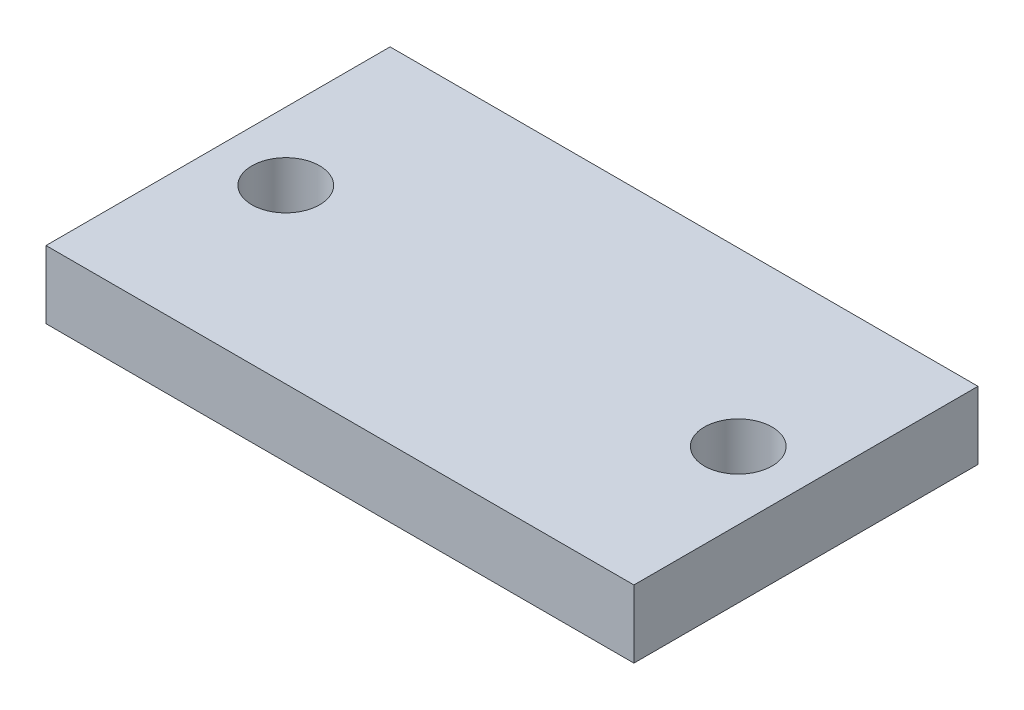
ISO-10303-21;
HEADER;
FILE_DESCRIPTION(('STEP AP214'),'2;1');
FILE_NAME('part.step','',(''),(''),'','','');
FILE_SCHEMA(('AUTOMOTIVE_DESIGN { 1 0 10303 214 1 1 1 1 }'));
ENDSEC;
DATA;
#1=APPLICATION_CONTEXT('core data for automotive mechanical design processes');
#2=APPLICATION_PROTOCOL_DEFINITION('international standard','automotive_design',2000,#1);
#3=PRODUCT_CONTEXT('',#1,'mechanical');
#4=PRODUCT('Part','Part','',(#3));
#5=PRODUCT_RELATED_PRODUCT_CATEGORY('part','',(#4));
#6=PRODUCT_DEFINITION_FORMATION('','',#4);
#7=PRODUCT_DEFINITION_CONTEXT('part definition',#1,'design');
#8=PRODUCT_DEFINITION('design','',#6,#7);
#9=PRODUCT_DEFINITION_SHAPE('','',#8);
#10=(LENGTH_UNIT() NAMED_UNIT(*) SI_UNIT(.MILLI.,.METRE.));
#11=(NAMED_UNIT(*) PLANE_ANGLE_UNIT() SI_UNIT($,.RADIAN.));
#12=(NAMED_UNIT(*) SI_UNIT($,.STERADIAN.) SOLID_ANGLE_UNIT());
#13=UNCERTAINTY_MEASURE_WITH_UNIT(LENGTH_MEASURE(1.E-05),#10,'distance_accuracy_value','');
#14=(GEOMETRIC_REPRESENTATION_CONTEXT(3) GLOBAL_UNCERTAINTY_ASSIGNED_CONTEXT((#13)) GLOBAL_UNIT_ASSIGNED_CONTEXT((#10,
#11,#12)) REPRESENTATION_CONTEXT('',''));
#15=CARTESIAN_POINT('',(0.,0.,0.));
#16=DIRECTION('',(0.,0.,1.));
#17=DIRECTION('',(1.,0.,0.));
#18=AXIS2_PLACEMENT_3D('',#15,#16,#17);
#19=CARTESIAN_POINT('',(0.,5.,0.));
#20=DIRECTION('',(0.,0.,-1.));
#21=DIRECTION('',(-1.,0.,0.));
#22=AXIS2_PLACEMENT_3D('',#19,#20,#21);
#23=PLANE('',#22);
#24=DIRECTION('',(1.,0.,0.));
#25=VECTOR('',#24,1.);
#26=CARTESIAN_POINT('',(0.,0.,0.));
#27=LINE('',#26,#25);
#28=CARTESIAN_POINT('',(-9.00000000000002,0.,0.));
#29=VERTEX_POINT('',#28);
#30=CARTESIAN_POINT('',(34.4,0.,0.));
#31=VERTEX_POINT('',#30);
#32=EDGE_CURVE('E95',#29,#31,#27,.T.);
#33=ORIENTED_EDGE('',*,*,#32,.T.);
#34=DIRECTION('',(0.,1.,0.));
#35=VECTOR('',#34,1.);
#36=CARTESIAN_POINT('',(34.4,-50.2863798657251,0.));
#37=LINE('',#36,#35);
#38=CARTESIAN_POINT('',(34.4,5.,0.));
#39=VERTEX_POINT('',#38);
#40=EDGE_CURVE('E74',#31,#39,#37,.T.);
#41=ORIENTED_EDGE('',*,*,#40,.T.);
#42=DIRECTION('',(1.,0.,0.));
#43=VECTOR('',#42,1.);
#44=CARTESIAN_POINT('',(0.,5.,0.));
#45=LINE('',#44,#43);
#46=CARTESIAN_POINT('',(-9.00000000000002,5.,0.));
#47=VERTEX_POINT('',#46);
#48=EDGE_CURVE('E42',#47,#39,#45,.T.);
#49=ORIENTED_EDGE('',*,*,#48,.F.);
#50=DIRECTION('',(0.,1.,0.));
#51=VECTOR('',#50,1.);
#52=CARTESIAN_POINT('',(-9.00000000000002,-50.2863798657251,0.));
#53=LINE('',#52,#51);
#54=EDGE_CURVE('E72',#29,#47,#53,.T.);
#55=ORIENTED_EDGE('',*,*,#54,.F.);
#56=EDGE_LOOP('',(#33,#41,#49,#55));
#57=FACE_BOUND('',#56,.T.);
#58=ADVANCED_FACE('F33',(#57),#23,.F.);
#59=CARTESIAN_POINT('',(0.,5.,-25.4));
#60=DIRECTION('',(0.,0.,-1.));
#61=DIRECTION('',(-1.,0.,0.));
#62=AXIS2_PLACEMENT_3D('',#59,#60,#61);
#63=PLANE('',#62);
#64=DIRECTION('',(1.,0.,0.));
#65=VECTOR('',#64,1.);
#66=CARTESIAN_POINT('',(0.,5.,-25.4));
#67=LINE('',#66,#65);
#68=CARTESIAN_POINT('',(-9.00000000000003,5.,-25.4));
#69=VERTEX_POINT('',#68);
#70=CARTESIAN_POINT('',(34.4,5.,-25.4));
#71=VERTEX_POINT('',#70);
#72=EDGE_CURVE('E11',#69,#71,#67,.T.);
#73=ORIENTED_EDGE('',*,*,#72,.T.);
#74=DIRECTION('',(0.,1.,0.));
#75=VECTOR('',#74,1.);
#76=CARTESIAN_POINT('',(34.4,-50.2863798657251,-25.4));
#77=LINE('',#76,#75);
#78=CARTESIAN_POINT('',(34.4,0.,-25.4));
#79=VERTEX_POINT('',#78);
#80=EDGE_CURVE('E90',#79,#71,#77,.T.);
#81=ORIENTED_EDGE('',*,*,#80,.F.);
#82=DIRECTION('',(1.,0.,0.));
#83=VECTOR('',#82,1.);
#84=CARTESIAN_POINT('',(0.,0.,-25.4));
#85=LINE('',#84,#83);
#86=CARTESIAN_POINT('',(-9.00000000000003,0.,-25.4));
#87=VERTEX_POINT('',#86);
#88=EDGE_CURVE('E51',#87,#79,#85,.T.);
#89=ORIENTED_EDGE('',*,*,#88,.F.);
#90=DIRECTION('',(0.,1.,0.));
#91=VECTOR('',#90,1.);
#92=CARTESIAN_POINT('',(-9.00000000000003,-50.2863798657251,-25.4));
#93=LINE('',#92,#91);
#94=EDGE_CURVE('E114',#87,#69,#93,.T.);
#95=ORIENTED_EDGE('',*,*,#94,.T.);
#96=EDGE_LOOP('',(#73,#81,#89,#95));
#97=FACE_BOUND('',#96,.T.);
#98=ADVANCED_FACE('F120',(#97),#63,.T.);
#99=CARTESIAN_POINT('',(0.,5.,0.));
#100=DIRECTION('',(0.,1.,0.));
#101=DIRECTION('',(0.,0.,1.));
#102=AXIS2_PLACEMENT_3D('',#99,#100,#101);
#103=PLANE('',#102);
#104=CARTESIAN_POINT('',(-4.00000000000003,5.,-12.7));
#105=DIRECTION('',(0.,1.,0.));
#106=DIRECTION('',(0.,0.,1.));
#107=AXIS2_PLACEMENT_3D('',#104,#105,#106);
#108=CIRCLE('',#107,2.5);
#109=CARTESIAN_POINT('',(-4.00000000000003,5.,-10.2));
#110=VERTEX_POINT('',#109);
#111=EDGE_CURVE('E99',#110,#110,#108,.T.);
#112=ORIENTED_EDGE('',*,*,#111,.F.);
#113=EDGE_LOOP('',(#112));
#114=FACE_BOUND('',#113,.T.);
#115=CARTESIAN_POINT('',(29.4,5.,-12.6999999999999));
#116=DIRECTION('',(0.,1.,0.));
#117=DIRECTION('',(0.,0.,1.));
#118=AXIS2_PLACEMENT_3D('',#115,#116,#117);
#119=CIRCLE('',#118,2.5);
#120=CARTESIAN_POINT('',(29.4,5.,-10.1999999999999));
#121=VERTEX_POINT('',#120);
#122=EDGE_CURVE('E104',#121,#121,#119,.T.);
#123=ORIENTED_EDGE('',*,*,#122,.F.);
#124=EDGE_LOOP('',(#123));
#125=FACE_BOUND('',#124,.T.);
#126=DIRECTION('',(0.,0.,-1.));
#127=VECTOR('',#126,1.);
#128=CARTESIAN_POINT('',(34.4,5.,-25.4));
#129=LINE('',#128,#127);
#130=EDGE_CURVE('E84',#39,#71,#129,.T.);
#131=ORIENTED_EDGE('',*,*,#130,.T.);
#132=ORIENTED_EDGE('',*,*,#72,.F.);
#133=DIRECTION('',(0.,0.,1.));
#134=VECTOR('',#133,1.);
#135=CARTESIAN_POINT('',(-9.00000000000003,5.,-25.4));
#136=LINE('',#135,#134);
#137=EDGE_CURVE('E80',#69,#47,#136,.T.);
#138=ORIENTED_EDGE('',*,*,#137,.T.);
#139=ORIENTED_EDGE('',*,*,#48,.T.);
#140=EDGE_LOOP('',(#131,#132,#138,#139));
#141=FACE_BOUND('',#140,.T.);
#142=ADVANCED_FACE('F81',(#114,#125,#141),#103,.T.);
#143=CARTESIAN_POINT('',(0.,0.,0.));
#144=DIRECTION('',(0.,1.,0.));
#145=DIRECTION('',(0.,0.,1.));
#146=AXIS2_PLACEMENT_3D('',#143,#144,#145);
#147=PLANE('',#146);
#148=CARTESIAN_POINT('',(-4.00000000000003,0.,-12.7));
#149=DIRECTION('',(0.,1.,0.));
#150=DIRECTION('',(0.,0.,1.));
#151=AXIS2_PLACEMENT_3D('',#148,#149,#150);
#152=CIRCLE('',#151,2.5);
#153=CARTESIAN_POINT('',(-4.00000000000003,0.,-10.2));
#154=VERTEX_POINT('',#153);
#155=EDGE_CURVE('E36',#154,#154,#152,.T.);
#156=ORIENTED_EDGE('',*,*,#155,.T.);
#157=EDGE_LOOP('',(#156));
#158=FACE_BOUND('',#157,.T.);
#159=CARTESIAN_POINT('',(29.4,0.,-12.6999999999999));
#160=DIRECTION('',(0.,1.,0.));
#161=DIRECTION('',(0.,0.,1.));
#162=AXIS2_PLACEMENT_3D('',#159,#160,#161);
#163=CIRCLE('',#162,2.5);
#164=CARTESIAN_POINT('',(29.4,0.,-10.1999999999999));
#165=VERTEX_POINT('',#164);
#166=EDGE_CURVE('E97',#165,#165,#163,.T.);
#167=ORIENTED_EDGE('',*,*,#166,.T.);
#168=EDGE_LOOP('',(#167));
#169=FACE_BOUND('',#168,.T.);
#170=ORIENTED_EDGE('',*,*,#88,.T.);
#171=DIRECTION('',(0.,0.,1.));
#172=VECTOR('',#171,1.);
#173=CARTESIAN_POINT('',(34.4,0.,-25.4));
#174=LINE('',#173,#172);
#175=EDGE_CURVE('E111',#79,#31,#174,.T.);
#176=ORIENTED_EDGE('',*,*,#175,.T.);
#177=ORIENTED_EDGE('',*,*,#32,.F.);
#178=DIRECTION('',(0.,0.,-1.));
#179=VECTOR('',#178,1.);
#180=CARTESIAN_POINT('',(-9.00000000000003,0.,-25.4));
#181=LINE('',#180,#179);
#182=EDGE_CURVE('E88',#29,#87,#181,.T.);
#183=ORIENTED_EDGE('',*,*,#182,.T.);
#184=EDGE_LOOP('',(#170,#176,#177,#183));
#185=FACE_BOUND('',#184,.T.);
#186=ADVANCED_FACE('F126',(#158,#169,#185),#147,.F.);
#187=CARTESIAN_POINT('',(-9.00000000000003,-50.2863798657251,-25.4));
#188=DIRECTION('',(-1.,0.,0.));
#189=DIRECTION('',(0.,0.,1.));
#190=AXIS2_PLACEMENT_3D('',#187,#188,#189);
#191=PLANE('',#190);
#192=ORIENTED_EDGE('',*,*,#137,.F.);
#193=ORIENTED_EDGE('',*,*,#94,.F.);
#194=ORIENTED_EDGE('',*,*,#182,.F.);
#195=ORIENTED_EDGE('',*,*,#54,.T.);
#196=EDGE_LOOP('',(#192,#193,#194,#195));
#197=FACE_BOUND('',#196,.T.);
#198=ADVANCED_FACE('F87',(#197),#191,.T.);
#199=CARTESIAN_POINT('',(34.4,-50.2863798657251,-25.4));
#200=DIRECTION('',(1.,0.,0.));
#201=DIRECTION('',(0.,0.,-1.));
#202=AXIS2_PLACEMENT_3D('',#199,#200,#201);
#203=PLANE('',#202);
#204=ORIENTED_EDGE('',*,*,#80,.T.);
#205=ORIENTED_EDGE('',*,*,#130,.F.);
#206=ORIENTED_EDGE('',*,*,#40,.F.);
#207=ORIENTED_EDGE('',*,*,#175,.F.);
#208=EDGE_LOOP('',(#204,#205,#206,#207));
#209=FACE_BOUND('',#208,.T.);
#210=ADVANCED_FACE('F119',(#209),#203,.T.);
#211=CARTESIAN_POINT('',(29.4,-5.,-12.6999999999999));
#212=DIRECTION('',(0.,1.,0.));
#213=DIRECTION('',(0.,0.,1.));
#214=AXIS2_PLACEMENT_3D('',#211,#212,#213);
#215=CYLINDRICAL_SURFACE('',#214,2.5);
#216=ORIENTED_EDGE('',*,*,#122,.T.);
#217=EDGE_LOOP('',(#216));
#218=FACE_BOUND('',#217,.T.);
#219=ORIENTED_EDGE('',*,*,#166,.F.);
#220=EDGE_LOOP('',(#219));
#221=FACE_BOUND('',#220,.T.);
#222=ADVANCED_FACE('F137',(#218,#221),#215,.F.);
#223=CARTESIAN_POINT('',(-4.00000000000003,-5.,-12.7));
#224=DIRECTION('',(0.,1.,0.));
#225=DIRECTION('',(0.,0.,1.));
#226=AXIS2_PLACEMENT_3D('',#223,#224,#225);
#227=CYLINDRICAL_SURFACE('',#226,2.5);
#228=ORIENTED_EDGE('',*,*,#111,.T.);
#229=EDGE_LOOP('',(#228));
#230=FACE_BOUND('',#229,.T.);
#231=ORIENTED_EDGE('',*,*,#155,.F.);
#232=EDGE_LOOP('',(#231));
#233=FACE_BOUND('',#232,.T.);
#234=ADVANCED_FACE('F140',(#230,#233),#227,.F.);
#235=CLOSED_SHELL('',(#58,#98,#142,#186,#198,#210,#222,#234));
#236=MANIFOLD_SOLID_BREP('B2',#235);
#237=ADVANCED_BREP_SHAPE_REPRESENTATION('',(#18,#236),#14);
#238=SHAPE_DEFINITION_REPRESENTATION(#9,#237);
ENDSEC;
END-ISO-10303-21;
